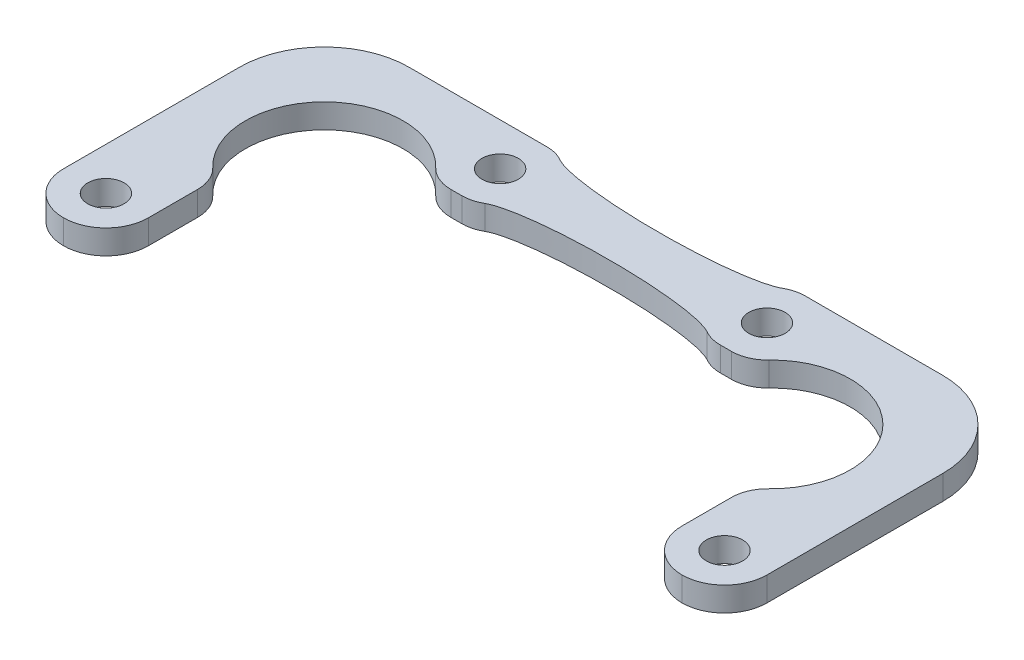
ISO-10303-21;
HEADER;
FILE_DESCRIPTION(('STEP AP214'),'2;1');
FILE_NAME('part.step','',(''),(''),'','','');
FILE_SCHEMA(('AUTOMOTIVE_DESIGN { 1 0 10303 214 1 1 1 1 }'));
ENDSEC;
DATA;
#1=APPLICATION_CONTEXT('core data for automotive mechanical design processes');
#2=APPLICATION_PROTOCOL_DEFINITION('international standard','automotive_design',2000,#1);
#3=PRODUCT_CONTEXT('',#1,'mechanical');
#4=PRODUCT('Part','Part','',(#3));
#5=PRODUCT_RELATED_PRODUCT_CATEGORY('part','',(#4));
#6=PRODUCT_DEFINITION_FORMATION('','',#4);
#7=PRODUCT_DEFINITION_CONTEXT('part definition',#1,'design');
#8=PRODUCT_DEFINITION('design','',#6,#7);
#9=PRODUCT_DEFINITION_SHAPE('','',#8);
#10=(LENGTH_UNIT() NAMED_UNIT(*) SI_UNIT(.MILLI.,.METRE.));
#11=(NAMED_UNIT(*) PLANE_ANGLE_UNIT() SI_UNIT($,.RADIAN.));
#12=(NAMED_UNIT(*) SI_UNIT($,.STERADIAN.) SOLID_ANGLE_UNIT());
#13=UNCERTAINTY_MEASURE_WITH_UNIT(LENGTH_MEASURE(1.E-05),#10,'distance_accuracy_value','');
#14=(GEOMETRIC_REPRESENTATION_CONTEXT(3) GLOBAL_UNCERTAINTY_ASSIGNED_CONTEXT((#13)) GLOBAL_UNIT_ASSIGNED_CONTEXT((#10,
#11,#12)) REPRESENTATION_CONTEXT('',''));
#15=CARTESIAN_POINT('',(0.,0.,0.));
#16=DIRECTION('',(0.,0.,1.));
#17=DIRECTION('',(1.,0.,0.));
#18=AXIS2_PLACEMENT_3D('',#15,#16,#17);
#19=CARTESIAN_POINT('',(-49.267229237635,2.,0.));
#20=DIRECTION('',(0.,0.,1.));
#21=DIRECTION('',(1.,0.,0.));
#22=AXIS2_PLACEMENT_3D('',#19,#20,#21);
#23=PLANE('',#22);
#24=DIRECTION('',(-1.,0.,0.));
#25=VECTOR('',#24,1.);
#26=CARTESIAN_POINT('',(-49.267229237635,2.,0.));
#27=LINE('',#26,#25);
#28=CARTESIAN_POINT('',(-10.6526722287908,2.,0.));
#29=VERTEX_POINT('',#28);
#30=CARTESIAN_POINT('',(-11.568376033097,2.,0.));
#31=VERTEX_POINT('',#30);
#32=EDGE_CURVE('E574',#29,#31,#27,.T.);
#33=ORIENTED_EDGE('',*,*,#32,.T.);
#34=DIRECTION('',(0.,1.,0.));
#35=VECTOR('',#34,1.);
#36=CARTESIAN_POINT('',(-11.568376033097,2.,0.));
#37=LINE('',#36,#35);
#38=CARTESIAN_POINT('',(-11.568376033097,0.,0.));
#39=VERTEX_POINT('',#38);
#40=EDGE_CURVE('E322',#31,#39,#37,.F.);
#41=ORIENTED_EDGE('',*,*,#40,.T.);
#42=DIRECTION('',(-1.,0.,0.));
#43=VECTOR('',#42,1.);
#44=CARTESIAN_POINT('',(-49.267229237635,0.,0.));
#45=LINE('',#44,#43);
#46=CARTESIAN_POINT('',(-10.6526722287908,0.,0.));
#47=VERTEX_POINT('',#46);
#48=EDGE_CURVE('E400',#47,#39,#45,.T.);
#49=ORIENTED_EDGE('',*,*,#48,.F.);
#50=DIRECTION('',(0.,1.,0.));
#51=VECTOR('',#50,1.);
#52=CARTESIAN_POINT('',(-10.6526722287908,2.,0.));
#53=LINE('',#52,#51);
#54=EDGE_CURVE('E319',#47,#29,#53,.T.);
#55=ORIENTED_EDGE('',*,*,#54,.T.);
#56=EDGE_LOOP('',(#33,#41,#49,#55));
#57=FACE_BOUND('',#56,.T.);
#58=ADVANCED_FACE('F34',(#57),#23,.T.);
#59=CARTESIAN_POINT('',(-49.267229237635,2.,5.50000000000001));
#60=DIRECTION('',(0.,1.,0.));
#61=DIRECTION('',(0.,0.,1.));
#62=AXIS2_PLACEMENT_3D('',#59,#60,#61);
#63=PLANE('',#62);
#64=CARTESIAN_POINT('',(-11.,2.,-3.5));
#65=DIRECTION('',(0.,1.,0.));
#66=DIRECTION('',(0.,0.,1.));
#67=AXIS2_PLACEMENT_3D('',#64,#65,#66);
#68=CIRCLE('',#67,1.5);
#69=CARTESIAN_POINT('',(-11.,2.,-2.));
#70=VERTEX_POINT('',#69);
#71=EDGE_CURVE('E250',#70,#70,#68,.T.);
#72=ORIENTED_EDGE('',*,*,#71,.F.);
#73=EDGE_LOOP('',(#72));
#74=FACE_BOUND('',#73,.T.);
#75=CARTESIAN_POINT('',(-25.5,2.,14.5));
#76=DIRECTION('',(0.,1.,0.));
#77=DIRECTION('',(0.,0.,1.));
#78=AXIS2_PLACEMENT_3D('',#75,#76,#77);
#79=CIRCLE('',#78,1.5);
#80=CARTESIAN_POINT('',(-25.5,2.,16.));
#81=VERTEX_POINT('',#80);
#82=EDGE_CURVE('E577',#81,#81,#79,.T.);
#83=ORIENTED_EDGE('',*,*,#82,.F.);
#84=EDGE_LOOP('',(#83));
#85=FACE_BOUND('',#84,.T.);
#86=CARTESIAN_POINT('',(11.,2.,-3.5));
#87=DIRECTION('',(0.,1.,0.));
#88=DIRECTION('',(0.,0.,1.));
#89=AXIS2_PLACEMENT_3D('',#86,#87,#88);
#90=CIRCLE('',#89,1.5);
#91=CARTESIAN_POINT('',(11.,2.,-2.));
#92=VERTEX_POINT('',#91);
#93=EDGE_CURVE('E391',#92,#92,#90,.F.);
#94=ORIENTED_EDGE('',*,*,#93,.T.);
#95=EDGE_LOOP('',(#94));
#96=FACE_BOUND('',#95,.T.);
#97=CARTESIAN_POINT('',(25.5,2.,14.5));
#98=DIRECTION('',(0.,1.,0.));
#99=DIRECTION('',(0.,0.,1.));
#100=AXIS2_PLACEMENT_3D('',#97,#98,#99);
#101=CIRCLE('',#100,1.5);
#102=CARTESIAN_POINT('',(25.5,2.,16.));
#103=VERTEX_POINT('',#102);
#104=EDGE_CURVE('E226',#103,#103,#101,.F.);
#105=ORIENTED_EDGE('',*,*,#104,.T.);
#106=EDGE_LOOP('',(#105));
#107=FACE_BOUND('',#106,.T.);
#108=DIRECTION('',(1.,0.,0.));
#109=VECTOR('',#108,1.);
#110=CARTESIAN_POINT('',(-49.267229237635,2.,-7.));
#111=LINE('',#110,#109);
#112=CARTESIAN_POINT('',(-22.,2.,-7.));
#113=VERTEX_POINT('',#112);
#114=CARTESIAN_POINT('',(-10.6526722287908,2.,-7.));
#115=VERTEX_POINT('',#114);
#116=EDGE_CURVE('E380',#113,#115,#111,.T.);
#117=ORIENTED_EDGE('',*,*,#116,.F.);
#118=CARTESIAN_POINT('',(-22.,2.,0.));
#119=DIRECTION('',(0.,1.,0.));
#120=DIRECTION('',(0.,0.,1.));
#121=AXIS2_PLACEMENT_3D('',#118,#119,#120);
#122=CIRCLE('',#121,7.);
#123=CARTESIAN_POINT('',(-29.,2.,0.));
#124=VERTEX_POINT('',#123);
#125=EDGE_CURVE('E361',#113,#124,#122,.T.);
#126=ORIENTED_EDGE('',*,*,#125,.T.);
#127=DIRECTION('',(0.,0.,-1.));
#128=VECTOR('',#127,1.);
#129=CARTESIAN_POINT('',(-29.,2.,5.50000000000001));
#130=LINE('',#129,#128);
#131=CARTESIAN_POINT('',(-29.,2.,14.5));
#132=VERTEX_POINT('',#131);
#133=EDGE_CURVE('E382',#132,#124,#130,.T.);
#134=ORIENTED_EDGE('',*,*,#133,.F.);
#135=CARTESIAN_POINT('',(-25.5,2.,14.5));
#136=DIRECTION('',(0.,1.,0.));
#137=DIRECTION('',(0.,0.,1.));
#138=AXIS2_PLACEMENT_3D('',#135,#136,#137);
#139=CIRCLE('',#138,3.5);
#140=CARTESIAN_POINT('',(-25.5,2.,18.));
#141=VERTEX_POINT('',#140);
#142=EDGE_CURVE('E219',#132,#141,#139,.T.);
#143=ORIENTED_EDGE('',*,*,#142,.T.);
#144=CARTESIAN_POINT('',(-25.5,2.,14.5));
#145=DIRECTION('',(0.,1.,0.));
#146=DIRECTION('',(0.,0.,1.));
#147=AXIS2_PLACEMENT_3D('',#144,#145,#146);
#148=CIRCLE('',#147,3.5);
#149=CARTESIAN_POINT('',(-22.,2.,14.5));
#150=VERTEX_POINT('',#149);
#151=EDGE_CURVE('E257',#141,#150,#148,.T.);
#152=ORIENTED_EDGE('',*,*,#151,.T.);
#153=DIRECTION('',(0.,0.,1.));
#154=VECTOR('',#153,1.);
#155=CARTESIAN_POINT('',(-22.,2.,5.5));
#156=LINE('',#155,#154);
#157=CARTESIAN_POINT('',(-22.,2.,10.431623966903));
#158=VERTEX_POINT('',#157);
#159=EDGE_CURVE('E389',#158,#150,#156,.T.);
#160=ORIENTED_EDGE('',*,*,#159,.F.);
#161=CARTESIAN_POINT('',(-25.,2.,10.431623966903));
#162=DIRECTION('',(0.,1.,0.));
#163=DIRECTION('',(0.,0.,1.));
#164=AXIS2_PLACEMENT_3D('',#161,#162,#163);
#165=CIRCLE('',#164,3.);
#166=CARTESIAN_POINT('',(-22.9269729515874,2.,8.26308555208307));
#167=VERTEX_POINT('',#166);
#168=EDGE_CURVE('E296',#158,#167,#165,.T.);
#169=ORIENTED_EDGE('',*,*,#168,.T.);
#170=CARTESIAN_POINT('',(-18.4354143466935,2.,3.56458565330652));
#171=DIRECTION('',(0.,-1.,0.));
#172=DIRECTION('',(0.,0.,-1.));
#173=AXIS2_PLACEMENT_3D('',#170,#171,#172);
#174=CIRCLE('',#173,6.5);
#175=CARTESIAN_POINT('',(-13.7369144479169,2.,-0.926972951587412));
#176=VERTEX_POINT('',#175);
#177=EDGE_CURVE('E558',#167,#176,#174,.T.);
#178=ORIENTED_EDGE('',*,*,#177,.T.);
#179=CARTESIAN_POINT('',(-11.568376033097,2.,-3.));
#180=DIRECTION('',(0.,1.,0.));
#181=DIRECTION('',(0.,0.,1.));
#182=AXIS2_PLACEMENT_3D('',#179,#180,#181);
#183=CIRCLE('',#182,3.);
#184=EDGE_CURVE('E294',#176,#31,#183,.T.);
#185=ORIENTED_EDGE('',*,*,#184,.T.);
#186=ORIENTED_EDGE('',*,*,#32,.F.);
#187=CARTESIAN_POINT('',(-10.6526722287908,2.,-2.99999999999999));
#188=DIRECTION('',(0.,1.,0.));
#189=DIRECTION('',(0.,0.,1.));
#190=AXIS2_PLACEMENT_3D('',#187,#188,#189);
#191=CIRCLE('',#190,3.);
#192=CARTESIAN_POINT('',(-9.15956668657666,2.,-0.397955450072106));
#193=VERTEX_POINT('',#192);
#194=EDGE_CURVE('E287',#29,#193,#191,.T.);
#195=ORIENTED_EDGE('',*,*,#194,.T.);
#196=CARTESIAN_POINT('',(0.,2.,0.));
#197=DIRECTION('',(0.,-1.,0.));
#198=DIRECTION('',(-1.,0.,0.));
#199=AXIS2_PLACEMENT_3D('',#196,#197,#198);
#200=ELLIPSE('',#199,9.5,1.5);
#201=CARTESIAN_POINT('',(9.15956668657666,2.,-0.397955450072107));
#202=VERTEX_POINT('',#201);
#203=EDGE_CURVE('E421',#193,#202,#200,.T.);
#204=ORIENTED_EDGE('',*,*,#203,.T.);
#205=CARTESIAN_POINT('',(10.6526722287908,2.,-2.99999999999999));
#206=DIRECTION('',(0.,1.,0.));
#207=DIRECTION('',(0.,0.,1.));
#208=AXIS2_PLACEMENT_3D('',#205,#206,#207);
#209=CIRCLE('',#208,3.);
#210=CARTESIAN_POINT('',(10.6526722287908,2.,0.));
#211=VERTEX_POINT('',#210);
#212=EDGE_CURVE('E281',#202,#211,#209,.T.);
#213=ORIENTED_EDGE('',*,*,#212,.T.);
#214=CARTESIAN_POINT('',(11.568376033097,2.,0.));
#215=VERTEX_POINT('',#214);
#216=EDGE_CURVE('E573',#215,#211,#27,.T.);
#217=ORIENTED_EDGE('',*,*,#216,.F.);
#218=CARTESIAN_POINT('',(11.568376033097,2.,-3.));
#219=DIRECTION('',(0.,1.,0.));
#220=DIRECTION('',(0.,0.,1.));
#221=AXIS2_PLACEMENT_3D('',#218,#219,#220);
#222=CIRCLE('',#221,3.);
#223=CARTESIAN_POINT('',(13.7369144479169,2.,-0.926972951587412));
#224=VERTEX_POINT('',#223);
#225=EDGE_CURVE('E283',#215,#224,#222,.T.);
#226=ORIENTED_EDGE('',*,*,#225,.T.);
#227=CARTESIAN_POINT('',(18.4354143466935,2.,3.56458565330652));
#228=DIRECTION('',(0.,1.,0.));
#229=DIRECTION('',(0.,0.,-1.));
#230=AXIS2_PLACEMENT_3D('',#227,#228,#229);
#231=CIRCLE('',#230,6.5);
#232=CARTESIAN_POINT('',(22.9269729515874,2.,8.26308555208307));
#233=VERTEX_POINT('',#232);
#234=EDGE_CURVE('E432',#233,#224,#231,.T.);
#235=ORIENTED_EDGE('',*,*,#234,.F.);
#236=CARTESIAN_POINT('',(25.,2.,10.431623966903));
#237=DIRECTION('',(0.,1.,0.));
#238=DIRECTION('',(0.,0.,1.));
#239=AXIS2_PLACEMENT_3D('',#236,#237,#238);
#240=CIRCLE('',#239,3.);
#241=CARTESIAN_POINT('',(22.,2.,10.431623966903));
#242=VERTEX_POINT('',#241);
#243=EDGE_CURVE('E285',#233,#242,#240,.T.);
#244=ORIENTED_EDGE('',*,*,#243,.T.);
#245=DIRECTION('',(0.,0.,1.));
#246=VECTOR('',#245,1.);
#247=CARTESIAN_POINT('',(22.,2.,5.50000000000002));
#248=LINE('',#247,#246);
#249=CARTESIAN_POINT('',(22.,2.,14.5));
#250=VERTEX_POINT('',#249);
#251=EDGE_CURVE('E383',#242,#250,#248,.T.);
#252=ORIENTED_EDGE('',*,*,#251,.T.);
#253=CARTESIAN_POINT('',(25.5,2.,14.5));
#254=DIRECTION('',(0.,1.,0.));
#255=DIRECTION('',(0.,0.,1.));
#256=AXIS2_PLACEMENT_3D('',#253,#254,#255);
#257=CIRCLE('',#256,3.5);
#258=CARTESIAN_POINT('',(25.5,2.,18.));
#259=VERTEX_POINT('',#258);
#260=EDGE_CURVE('E260',#250,#259,#257,.T.);
#261=ORIENTED_EDGE('',*,*,#260,.T.);
#262=CARTESIAN_POINT('',(25.5,2.,14.5));
#263=DIRECTION('',(0.,1.,0.));
#264=DIRECTION('',(0.,0.,1.));
#265=AXIS2_PLACEMENT_3D('',#262,#263,#264);
#266=CIRCLE('',#265,3.5);
#267=CARTESIAN_POINT('',(29.,2.,14.5));
#268=VERTEX_POINT('',#267);
#269=EDGE_CURVE('E262',#259,#268,#266,.T.);
#270=ORIENTED_EDGE('',*,*,#269,.T.);
#271=DIRECTION('',(0.,0.,-1.));
#272=VECTOR('',#271,1.);
#273=CARTESIAN_POINT('',(29.,2.,5.50000000000001));
#274=LINE('',#273,#272);
#275=CARTESIAN_POINT('',(29.,2.,0.));
#276=VERTEX_POINT('',#275);
#277=EDGE_CURVE('E224',#268,#276,#274,.T.);
#278=ORIENTED_EDGE('',*,*,#277,.T.);
#279=CARTESIAN_POINT('',(22.,2.,0.));
#280=DIRECTION('',(0.,1.,0.));
#281=DIRECTION('',(0.,0.,1.));
#282=AXIS2_PLACEMENT_3D('',#279,#280,#281);
#283=CIRCLE('',#282,7.);
#284=CARTESIAN_POINT('',(22.,2.,-7.));
#285=VERTEX_POINT('',#284);
#286=EDGE_CURVE('E49',#276,#285,#283,.T.);
#287=ORIENTED_EDGE('',*,*,#286,.T.);
#288=CARTESIAN_POINT('',(10.6526722287908,2.,-7.));
#289=VERTEX_POINT('',#288);
#290=EDGE_CURVE('E368',#289,#285,#111,.T.);
#291=ORIENTED_EDGE('',*,*,#290,.F.);
#292=CARTESIAN_POINT('',(10.6526722287908,2.,-4.00000000000001));
#293=DIRECTION('',(0.,1.,0.));
#294=DIRECTION('',(0.,0.,1.));
#295=AXIS2_PLACEMENT_3D('',#292,#293,#294);
#296=CIRCLE('',#295,3.);
#297=CARTESIAN_POINT('',(9.15956668657666,2.,-6.60204454992789));
#298=VERTEX_POINT('',#297);
#299=EDGE_CURVE('E289',#289,#298,#296,.T.);
#300=ORIENTED_EDGE('',*,*,#299,.T.);
#301=CARTESIAN_POINT('',(0.,2.,-7.));
#302=DIRECTION('',(0.,1.,0.));
#303=DIRECTION('',(-1.,0.,0.));
#304=AXIS2_PLACEMENT_3D('',#301,#302,#303);
#305=ELLIPSE('',#304,9.5,1.5);
#306=CARTESIAN_POINT('',(-9.15956668657666,2.,-6.60204454992789));
#307=VERTEX_POINT('',#306);
#308=EDGE_CURVE('E429',#307,#298,#305,.T.);
#309=ORIENTED_EDGE('',*,*,#308,.F.);
#310=CARTESIAN_POINT('',(-10.6526722287908,2.,-4.00000000000001));
#311=DIRECTION('',(0.,1.,0.));
#312=DIRECTION('',(0.,0.,1.));
#313=AXIS2_PLACEMENT_3D('',#310,#311,#312);
#314=CIRCLE('',#313,3.);
#315=EDGE_CURVE('E291',#307,#115,#314,.T.);
#316=ORIENTED_EDGE('',*,*,#315,.T.);
#317=EDGE_LOOP('',(#117,#126,#134,#143,#152,#160,#169,#178,#185,#186,#195,#204,#213,#217,#226,
#235,#244,#252,#261,#270,#278,#287,#291,#300,#309,#316));
#318=FACE_BOUND('',#317,.T.);
#319=ADVANCED_FACE('F377',(#74,#85,#96,#107,#318),#63,.T.);
#320=CARTESIAN_POINT('',(-49.267229237635,0.,5.50000000000001));
#321=DIRECTION('',(0.,1.,0.));
#322=DIRECTION('',(0.,0.,1.));
#323=AXIS2_PLACEMENT_3D('',#320,#321,#322);
#324=PLANE('',#323);
#325=CARTESIAN_POINT('',(-11.,0.,-3.5));
#326=DIRECTION('',(0.,1.,0.));
#327=DIRECTION('',(0.,0.,1.));
#328=AXIS2_PLACEMENT_3D('',#325,#326,#327);
#329=CIRCLE('',#328,1.5);
#330=CARTESIAN_POINT('',(-11.,0.,-2.));
#331=VERTEX_POINT('',#330);
#332=EDGE_CURVE('E274',#331,#331,#329,.T.);
#333=ORIENTED_EDGE('',*,*,#332,.T.);
#334=EDGE_LOOP('',(#333));
#335=FACE_BOUND('',#334,.T.);
#336=CARTESIAN_POINT('',(-25.5,0.,14.5));
#337=DIRECTION('',(0.,1.,0.));
#338=DIRECTION('',(0.,0.,1.));
#339=AXIS2_PLACEMENT_3D('',#336,#337,#338);
#340=CIRCLE('',#339,1.5);
#341=CARTESIAN_POINT('',(-25.5,0.,16.));
#342=VERTEX_POINT('',#341);
#343=EDGE_CURVE('E398',#342,#342,#340,.T.);
#344=ORIENTED_EDGE('',*,*,#343,.T.);
#345=EDGE_LOOP('',(#344));
#346=FACE_BOUND('',#345,.T.);
#347=CARTESIAN_POINT('',(11.,0.,-3.5));
#348=DIRECTION('',(0.,1.,0.));
#349=DIRECTION('',(0.,0.,1.));
#350=AXIS2_PLACEMENT_3D('',#347,#348,#349);
#351=CIRCLE('',#350,1.5);
#352=CARTESIAN_POINT('',(11.,0.,-2.));
#353=VERTEX_POINT('',#352);
#354=EDGE_CURVE('E245',#353,#353,#351,.F.);
#355=ORIENTED_EDGE('',*,*,#354,.F.);
#356=EDGE_LOOP('',(#355));
#357=FACE_BOUND('',#356,.T.);
#358=CARTESIAN_POINT('',(25.5,0.,14.5));
#359=DIRECTION('',(0.,1.,0.));
#360=DIRECTION('',(0.,0.,1.));
#361=AXIS2_PLACEMENT_3D('',#358,#359,#360);
#362=CIRCLE('',#361,1.5);
#363=CARTESIAN_POINT('',(25.5,0.,16.));
#364=VERTEX_POINT('',#363);
#365=EDGE_CURVE('E248',#364,#364,#362,.F.);
#366=ORIENTED_EDGE('',*,*,#365,.F.);
#367=EDGE_LOOP('',(#366));
#368=FACE_BOUND('',#367,.T.);
#369=DIRECTION('',(0.,0.,-1.));
#370=VECTOR('',#369,1.);
#371=CARTESIAN_POINT('',(-29.,0.,5.50000000000001));
#372=LINE('',#371,#370);
#373=CARTESIAN_POINT('',(-29.,0.,14.5));
#374=VERTEX_POINT('',#373);
#375=CARTESIAN_POINT('',(-29.,0.,0.));
#376=VERTEX_POINT('',#375);
#377=EDGE_CURVE('E241',#374,#376,#372,.T.);
#378=ORIENTED_EDGE('',*,*,#377,.T.);
#379=CARTESIAN_POINT('',(-22.,0.,0.));
#380=DIRECTION('',(0.,1.,0.));
#381=DIRECTION('',(0.,0.,1.));
#382=AXIS2_PLACEMENT_3D('',#379,#380,#381);
#383=CIRCLE('',#382,7.);
#384=CARTESIAN_POINT('',(-22.,0.,-7.));
#385=VERTEX_POINT('',#384);
#386=EDGE_CURVE('E356',#376,#385,#383,.F.);
#387=ORIENTED_EDGE('',*,*,#386,.T.);
#388=DIRECTION('',(1.,0.,0.));
#389=VECTOR('',#388,1.);
#390=CARTESIAN_POINT('',(-49.267229237635,0.,-7.));
#391=LINE('',#390,#389);
#392=CARTESIAN_POINT('',(-10.6526722287908,0.,-7.));
#393=VERTEX_POINT('',#392);
#394=EDGE_CURVE('E235',#385,#393,#391,.T.);
#395=ORIENTED_EDGE('',*,*,#394,.T.);
#396=CARTESIAN_POINT('',(-10.6526722287908,0.,-4.00000000000001));
#397=DIRECTION('',(0.,1.,0.));
#398=DIRECTION('',(0.,0.,1.));
#399=AXIS2_PLACEMENT_3D('',#396,#397,#398);
#400=CIRCLE('',#399,3.);
#401=CARTESIAN_POINT('',(-9.15956668657666,0.,-6.60204454992789));
#402=VERTEX_POINT('',#401);
#403=EDGE_CURVE('E313',#393,#402,#400,.F.);
#404=ORIENTED_EDGE('',*,*,#403,.T.);
#405=CARTESIAN_POINT('',(0.,0.,-7.));
#406=DIRECTION('',(0.,1.,0.));
#407=DIRECTION('',(-1.,0.,0.));
#408=AXIS2_PLACEMENT_3D('',#405,#406,#407);
#409=ELLIPSE('',#408,9.5,1.5);
#410=CARTESIAN_POINT('',(9.15956668657666,0.,-6.60204454992789));
#411=VERTEX_POINT('',#410);
#412=EDGE_CURVE('E278',#411,#402,#409,.F.);
#413=ORIENTED_EDGE('',*,*,#412,.F.);
#414=CARTESIAN_POINT('',(10.6526722287908,0.,-4.00000000000001));
#415=DIRECTION('',(0.,1.,0.));
#416=DIRECTION('',(0.,0.,1.));
#417=AXIS2_PLACEMENT_3D('',#414,#415,#416);
#418=CIRCLE('',#417,3.);
#419=CARTESIAN_POINT('',(10.6526722287908,0.,-7.));
#420=VERTEX_POINT('',#419);
#421=EDGE_CURVE('E311',#411,#420,#418,.F.);
#422=ORIENTED_EDGE('',*,*,#421,.T.);
#423=CARTESIAN_POINT('',(22.,0.,-7.));
#424=VERTEX_POINT('',#423);
#425=EDGE_CURVE('E232',#420,#424,#391,.T.);
#426=ORIENTED_EDGE('',*,*,#425,.T.);
#427=CARTESIAN_POINT('',(22.,0.,0.));
#428=DIRECTION('',(0.,1.,0.));
#429=DIRECTION('',(0.,0.,1.));
#430=AXIS2_PLACEMENT_3D('',#427,#428,#429);
#431=CIRCLE('',#430,7.);
#432=CARTESIAN_POINT('',(29.,0.,0.));
#433=VERTEX_POINT('',#432);
#434=EDGE_CURVE('E231',#424,#433,#431,.F.);
#435=ORIENTED_EDGE('',*,*,#434,.T.);
#436=DIRECTION('',(0.,0.,-1.));
#437=VECTOR('',#436,1.);
#438=CARTESIAN_POINT('',(29.,0.,5.50000000000001));
#439=LINE('',#438,#437);
#440=CARTESIAN_POINT('',(29.,0.,14.5));
#441=VERTEX_POINT('',#440);
#442=EDGE_CURVE('E223',#441,#433,#439,.T.);
#443=ORIENTED_EDGE('',*,*,#442,.F.);
#444=CARTESIAN_POINT('',(25.5,0.,14.5));
#445=DIRECTION('',(0.,1.,0.));
#446=DIRECTION('',(0.,0.,1.));
#447=AXIS2_PLACEMENT_3D('',#444,#445,#446);
#448=CIRCLE('',#447,3.5);
#449=CARTESIAN_POINT('',(25.5,0.,18.));
#450=VERTEX_POINT('',#449);
#451=EDGE_CURVE('E208',#441,#450,#448,.F.);
#452=ORIENTED_EDGE('',*,*,#451,.T.);
#453=CARTESIAN_POINT('',(25.5,0.,14.5));
#454=DIRECTION('',(0.,1.,0.));
#455=DIRECTION('',(0.,0.,1.));
#456=AXIS2_PLACEMENT_3D('',#453,#454,#455);
#457=CIRCLE('',#456,3.5);
#458=CARTESIAN_POINT('',(22.,0.,14.5));
#459=VERTEX_POINT('',#458);
#460=EDGE_CURVE('E220',#450,#459,#457,.F.);
#461=ORIENTED_EDGE('',*,*,#460,.T.);
#462=DIRECTION('',(0.,0.,1.));
#463=VECTOR('',#462,1.);
#464=CARTESIAN_POINT('',(22.,0.,5.50000000000002));
#465=LINE('',#464,#463);
#466=CARTESIAN_POINT('',(22.,0.,10.431623966903));
#467=VERTEX_POINT('',#466);
#468=EDGE_CURVE('E233',#467,#459,#465,.T.);
#469=ORIENTED_EDGE('',*,*,#468,.F.);
#470=CARTESIAN_POINT('',(25.,0.,10.431623966903));
#471=DIRECTION('',(0.,1.,0.));
#472=DIRECTION('',(0.,0.,1.));
#473=AXIS2_PLACEMENT_3D('',#470,#471,#472);
#474=CIRCLE('',#473,3.);
#475=CARTESIAN_POINT('',(22.9269729515874,0.,8.26308555208307));
#476=VERTEX_POINT('',#475);
#477=EDGE_CURVE('E307',#467,#476,#474,.F.);
#478=ORIENTED_EDGE('',*,*,#477,.T.);
#479=CARTESIAN_POINT('',(18.4354143466935,0.,3.56458565330652));
#480=DIRECTION('',(0.,1.,0.));
#481=DIRECTION('',(0.,0.,1.));
#482=AXIS2_PLACEMENT_3D('',#479,#480,#481);
#483=CIRCLE('',#482,6.5);
#484=CARTESIAN_POINT('',(13.7369144479169,0.,-0.926972951587412));
#485=VERTEX_POINT('',#484);
#486=EDGE_CURVE('E427',#485,#476,#483,.F.);
#487=ORIENTED_EDGE('',*,*,#486,.F.);
#488=CARTESIAN_POINT('',(11.568376033097,0.,-3.));
#489=DIRECTION('',(0.,1.,0.));
#490=DIRECTION('',(0.,0.,1.));
#491=AXIS2_PLACEMENT_3D('',#488,#489,#490);
#492=CIRCLE('',#491,3.);
#493=CARTESIAN_POINT('',(11.568376033097,0.,0.));
#494=VERTEX_POINT('',#493);
#495=EDGE_CURVE('E305',#485,#494,#492,.F.);
#496=ORIENTED_EDGE('',*,*,#495,.T.);
#497=CARTESIAN_POINT('',(10.6526722287908,0.,0.));
#498=VERTEX_POINT('',#497);
#499=EDGE_CURVE('E237',#494,#498,#45,.T.);
#500=ORIENTED_EDGE('',*,*,#499,.T.);
#501=CARTESIAN_POINT('',(10.6526722287908,0.,-2.99999999999999));
#502=DIRECTION('',(0.,1.,0.));
#503=DIRECTION('',(0.,0.,1.));
#504=AXIS2_PLACEMENT_3D('',#501,#502,#503);
#505=CIRCLE('',#504,3.);
#506=CARTESIAN_POINT('',(9.15956668657666,0.,-0.397955450072107));
#507=VERTEX_POINT('',#506);
#508=EDGE_CURVE('E303',#498,#507,#505,.F.);
#509=ORIENTED_EDGE('',*,*,#508,.T.);
#510=CARTESIAN_POINT('',(0.,0.,0.));
#511=DIRECTION('',(0.,-1.,0.));
#512=DIRECTION('',(-1.,0.,0.));
#513=AXIS2_PLACEMENT_3D('',#510,#511,#512);
#514=ELLIPSE('',#513,9.5,1.5);
#515=CARTESIAN_POINT('',(-9.15956668657666,0.,-0.397955450072106));
#516=VERTEX_POINT('',#515);
#517=EDGE_CURVE('E423',#507,#516,#514,.F.);
#518=ORIENTED_EDGE('',*,*,#517,.T.);
#519=CARTESIAN_POINT('',(-10.6526722287908,0.,-2.99999999999999));
#520=DIRECTION('',(0.,1.,0.));
#521=DIRECTION('',(0.,0.,1.));
#522=AXIS2_PLACEMENT_3D('',#519,#520,#521);
#523=CIRCLE('',#522,3.);
#524=EDGE_CURVE('E309',#516,#47,#523,.F.);
#525=ORIENTED_EDGE('',*,*,#524,.T.);
#526=ORIENTED_EDGE('',*,*,#48,.T.);
#527=CARTESIAN_POINT('',(-11.568376033097,0.,-3.));
#528=DIRECTION('',(0.,1.,0.));
#529=DIRECTION('',(0.,0.,1.));
#530=AXIS2_PLACEMENT_3D('',#527,#528,#529);
#531=CIRCLE('',#530,3.);
#532=CARTESIAN_POINT('',(-13.7369144479169,0.,-0.926972951587412));
#533=VERTEX_POINT('',#532);
#534=EDGE_CURVE('E315',#39,#533,#531,.F.);
#535=ORIENTED_EDGE('',*,*,#534,.T.);
#536=CARTESIAN_POINT('',(-18.4354143466935,0.,3.56458565330652));
#537=DIRECTION('',(0.,1.,0.));
#538=DIRECTION('',(0.,0.,1.));
#539=AXIS2_PLACEMENT_3D('',#536,#537,#538);
#540=CIRCLE('',#539,6.5);
#541=CARTESIAN_POINT('',(-22.9269729515874,0.,8.26308555208307));
#542=VERTEX_POINT('',#541);
#543=EDGE_CURVE('E563',#533,#542,#540,.T.);
#544=ORIENTED_EDGE('',*,*,#543,.T.);
#545=CARTESIAN_POINT('',(-25.,0.,10.431623966903));
#546=DIRECTION('',(0.,1.,0.));
#547=DIRECTION('',(0.,0.,1.));
#548=AXIS2_PLACEMENT_3D('',#545,#546,#547);
#549=CIRCLE('',#548,3.);
#550=CARTESIAN_POINT('',(-22.,0.,10.431623966903));
#551=VERTEX_POINT('',#550);
#552=EDGE_CURVE('E317',#542,#551,#549,.F.);
#553=ORIENTED_EDGE('',*,*,#552,.T.);
#554=DIRECTION('',(0.,0.,1.));
#555=VECTOR('',#554,1.);
#556=CARTESIAN_POINT('',(-22.,0.,5.5));
#557=LINE('',#556,#555);
#558=CARTESIAN_POINT('',(-22.,0.,14.5));
#559=VERTEX_POINT('',#558);
#560=EDGE_CURVE('E243',#551,#559,#557,.T.);
#561=ORIENTED_EDGE('',*,*,#560,.T.);
#562=CARTESIAN_POINT('',(-25.5,0.,14.5));
#563=DIRECTION('',(0.,1.,0.));
#564=DIRECTION('',(0.,0.,1.));
#565=AXIS2_PLACEMENT_3D('',#562,#563,#564);
#566=CIRCLE('',#565,3.5);
#567=CARTESIAN_POINT('',(-25.5,0.,18.));
#568=VERTEX_POINT('',#567);
#569=EDGE_CURVE('E253',#559,#568,#566,.F.);
#570=ORIENTED_EDGE('',*,*,#569,.T.);
#571=CARTESIAN_POINT('',(-25.5,0.,14.5));
#572=DIRECTION('',(0.,1.,0.));
#573=DIRECTION('',(0.,0.,1.));
#574=AXIS2_PLACEMENT_3D('',#571,#572,#573);
#575=CIRCLE('',#574,3.5);
#576=EDGE_CURVE('E225',#568,#374,#575,.F.);
#577=ORIENTED_EDGE('',*,*,#576,.T.);
#578=EDGE_LOOP('',(#378,#387,#395,#404,#413,#422,#426,#435,#443,#452,#461,#469,#478,#487,#496,
#500,#509,#518,#525,#526,#535,#544,#553,#561,#570,#577));
#579=FACE_BOUND('',#578,.T.);
#580=ADVANCED_FACE('F229',(#335,#346,#357,#368,#579),#324,.F.);
#581=CARTESIAN_POINT('',(-22.,2.,5.5));
#582=DIRECTION('',(1.,0.,0.));
#583=DIRECTION('',(0.,0.,-1.));
#584=AXIS2_PLACEMENT_3D('',#581,#582,#583);
#585=PLANE('',#584);
#586=ORIENTED_EDGE('',*,*,#560,.F.);
#587=DIRECTION('',(0.,1.,0.));
#588=VECTOR('',#587,1.);
#589=CARTESIAN_POINT('',(-22.,2.,10.431623966903));
#590=LINE('',#589,#588);
#591=EDGE_CURVE('E272',#551,#158,#590,.T.);
#592=ORIENTED_EDGE('',*,*,#591,.T.);
#593=ORIENTED_EDGE('',*,*,#159,.T.);
#594=DIRECTION('',(0.,-1.,0.));
#595=VECTOR('',#594,1.);
#596=CARTESIAN_POINT('',(-22.,2.,14.5));
#597=LINE('',#596,#595);
#598=EDGE_CURVE('E267',#150,#559,#597,.T.);
#599=ORIENTED_EDGE('',*,*,#598,.T.);
#600=EDGE_LOOP('',(#586,#592,#593,#599));
#601=FACE_BOUND('',#600,.T.);
#602=ADVANCED_FACE('F454',(#601),#585,.T.);
#603=ORIENTED_EDGE('',*,*,#499,.F.);
#604=DIRECTION('',(0.,-1.,0.));
#605=VECTOR('',#604,1.);
#606=CARTESIAN_POINT('',(11.568376033097,2.,0.));
#607=LINE('',#606,#605);
#608=EDGE_CURVE('E349',#494,#215,#607,.F.);
#609=ORIENTED_EDGE('',*,*,#608,.T.);
#610=ORIENTED_EDGE('',*,*,#216,.T.);
#611=DIRECTION('',(0.,1.,0.));
#612=VECTOR('',#611,1.);
#613=CARTESIAN_POINT('',(10.6526722287908,2.,0.));
#614=LINE('',#613,#612);
#615=EDGE_CURVE('E347',#211,#498,#614,.F.);
#616=ORIENTED_EDGE('',*,*,#615,.T.);
#617=EDGE_LOOP('',(#603,#609,#610,#616));
#618=FACE_BOUND('',#617,.T.);
#619=ADVANCED_FACE('F470',(#618),#23,.T.);
#620=CARTESIAN_POINT('',(-49.267229237635,2.,-7.));
#621=DIRECTION('',(0.,0.,-1.));
#622=DIRECTION('',(-1.,0.,0.));
#623=AXIS2_PLACEMENT_3D('',#620,#621,#622);
#624=PLANE('',#623);
#625=ORIENTED_EDGE('',*,*,#394,.F.);
#626=DIRECTION('',(0.,-1.,0.));
#627=VECTOR('',#626,1.);
#628=CARTESIAN_POINT('',(-22.,2.,-7.));
#629=LINE('',#628,#627);
#630=EDGE_CURVE('E358',#385,#113,#629,.F.);
#631=ORIENTED_EDGE('',*,*,#630,.T.);
#632=ORIENTED_EDGE('',*,*,#116,.T.);
#633=DIRECTION('',(0.,-1.,0.));
#634=VECTOR('',#633,1.);
#635=CARTESIAN_POINT('',(-10.6526722287908,0.,-7.));
#636=LINE('',#635,#634);
#637=EDGE_CURVE('E329',#115,#393,#636,.T.);
#638=ORIENTED_EDGE('',*,*,#637,.T.);
#639=EDGE_LOOP('',(#625,#631,#632,#638));
#640=FACE_BOUND('',#639,.T.);
#641=ADVANCED_FACE('F477',(#640),#624,.T.);
#642=CARTESIAN_POINT('',(22.,2.,5.50000000000002));
#643=DIRECTION('',(1.,0.,0.));
#644=DIRECTION('',(0.,0.,-1.));
#645=AXIS2_PLACEMENT_3D('',#642,#643,#644);
#646=PLANE('',#645);
#647=ORIENTED_EDGE('',*,*,#251,.F.);
#648=DIRECTION('',(0.,1.,0.));
#649=VECTOR('',#648,1.);
#650=CARTESIAN_POINT('',(22.,2.,10.431623966903));
#651=LINE('',#650,#649);
#652=EDGE_CURVE('E345',#242,#467,#651,.F.);
#653=ORIENTED_EDGE('',*,*,#652,.T.);
#654=ORIENTED_EDGE('',*,*,#468,.T.);
#655=DIRECTION('',(0.,-1.,0.));
#656=VECTOR('',#655,1.);
#657=CARTESIAN_POINT('',(22.,2.,14.5));
#658=LINE('',#657,#656);
#659=EDGE_CURVE('E264',#459,#250,#658,.F.);
#660=ORIENTED_EDGE('',*,*,#659,.T.);
#661=EDGE_LOOP('',(#647,#653,#654,#660));
#662=FACE_BOUND('',#661,.T.);
#663=ADVANCED_FACE('F480',(#662),#646,.F.);
#664=CARTESIAN_POINT('',(29.,2.,5.50000000000001));
#665=DIRECTION('',(-1.,0.,0.));
#666=DIRECTION('',(0.,0.,1.));
#667=AXIS2_PLACEMENT_3D('',#664,#665,#666);
#668=PLANE('',#667);
#669=ORIENTED_EDGE('',*,*,#442,.T.);
#670=DIRECTION('',(0.,-1.,0.));
#671=VECTOR('',#670,1.);
#672=CARTESIAN_POINT('',(29.,2.,0.));
#673=LINE('',#672,#671);
#674=EDGE_CURVE('E11',#433,#276,#673,.F.);
#675=ORIENTED_EDGE('',*,*,#674,.T.);
#676=ORIENTED_EDGE('',*,*,#277,.F.);
#677=DIRECTION('',(0.,-1.,0.));
#678=VECTOR('',#677,1.);
#679=CARTESIAN_POINT('',(29.,2.,14.5));
#680=LINE('',#679,#678);
#681=EDGE_CURVE('E212',#268,#441,#680,.T.);
#682=ORIENTED_EDGE('',*,*,#681,.T.);
#683=EDGE_LOOP('',(#669,#675,#676,#682));
#684=FACE_BOUND('',#683,.T.);
#685=ADVANCED_FACE('F222',(#684),#668,.F.);
#686=ORIENTED_EDGE('',*,*,#290,.T.);
#687=DIRECTION('',(0.,-1.,0.));
#688=VECTOR('',#687,1.);
#689=CARTESIAN_POINT('',(22.,0.,-7.));
#690=LINE('',#689,#688);
#691=EDGE_CURVE('E42',#285,#424,#690,.T.);
#692=ORIENTED_EDGE('',*,*,#691,.T.);
#693=ORIENTED_EDGE('',*,*,#425,.F.);
#694=DIRECTION('',(0.,-1.,0.));
#695=VECTOR('',#694,1.);
#696=CARTESIAN_POINT('',(10.6526722287908,2.,-7.));
#697=LINE('',#696,#695);
#698=EDGE_CURVE('E332',#420,#289,#697,.F.);
#699=ORIENTED_EDGE('',*,*,#698,.T.);
#700=EDGE_LOOP('',(#686,#692,#693,#699));
#701=FACE_BOUND('',#700,.T.);
#702=ADVANCED_FACE('F366',(#701),#624,.T.);
#703=CARTESIAN_POINT('',(-29.,2.,5.50000000000001));
#704=DIRECTION('',(-1.,0.,0.));
#705=DIRECTION('',(0.,0.,1.));
#706=AXIS2_PLACEMENT_3D('',#703,#704,#705);
#707=PLANE('',#706);
#708=ORIENTED_EDGE('',*,*,#133,.T.);
#709=DIRECTION('',(0.,-1.,0.));
#710=VECTOR('',#709,1.);
#711=CARTESIAN_POINT('',(-29.,2.,0.));
#712=LINE('',#711,#710);
#713=EDGE_CURVE('E352',#124,#376,#712,.T.);
#714=ORIENTED_EDGE('',*,*,#713,.T.);
#715=ORIENTED_EDGE('',*,*,#377,.F.);
#716=DIRECTION('',(0.,-1.,0.));
#717=VECTOR('',#716,1.);
#718=CARTESIAN_POINT('',(-29.,2.,14.5));
#719=LINE('',#718,#717);
#720=EDGE_CURVE('E270',#374,#132,#719,.F.);
#721=ORIENTED_EDGE('',*,*,#720,.T.);
#722=EDGE_LOOP('',(#708,#714,#715,#721));
#723=FACE_BOUND('',#722,.T.);
#724=ADVANCED_FACE('F466',(#723),#707,.T.);
#725=CARTESIAN_POINT('',(11.,2.,-3.5));
#726=DIRECTION('',(0.,-1.,0.));
#727=DIRECTION('',(0.,0.,-1.));
#728=AXIS2_PLACEMENT_3D('',#725,#726,#727);
#729=CYLINDRICAL_SURFACE('',#728,1.5);
#730=ORIENTED_EDGE('',*,*,#93,.F.);
#731=EDGE_LOOP('',(#730));
#732=FACE_BOUND('',#731,.T.);
#733=ORIENTED_EDGE('',*,*,#354,.T.);
#734=EDGE_LOOP('',(#733));
#735=FACE_BOUND('',#734,.T.);
#736=ADVANCED_FACE('F462',(#732,#735),#729,.F.);
#737=CARTESIAN_POINT('',(-25.5,2.,14.5));
#738=DIRECTION('',(0.,-1.,0.));
#739=DIRECTION('',(0.,0.,-1.));
#740=AXIS2_PLACEMENT_3D('',#737,#738,#739);
#741=CYLINDRICAL_SURFACE('',#740,1.5);
#742=ORIENTED_EDGE('',*,*,#82,.T.);
#743=EDGE_LOOP('',(#742));
#744=FACE_BOUND('',#743,.T.);
#745=ORIENTED_EDGE('',*,*,#343,.F.);
#746=EDGE_LOOP('',(#745));
#747=FACE_BOUND('',#746,.T.);
#748=ADVANCED_FACE('F465',(#744,#747),#741,.F.);
#749=CARTESIAN_POINT('',(-11.,2.,-3.5));
#750=DIRECTION('',(0.,-1.,0.));
#751=DIRECTION('',(0.,0.,-1.));
#752=AXIS2_PLACEMENT_3D('',#749,#750,#751);
#753=CYLINDRICAL_SURFACE('',#752,1.5);
#754=ORIENTED_EDGE('',*,*,#71,.T.);
#755=EDGE_LOOP('',(#754));
#756=FACE_BOUND('',#755,.T.);
#757=ORIENTED_EDGE('',*,*,#332,.F.);
#758=EDGE_LOOP('',(#757));
#759=FACE_BOUND('',#758,.T.);
#760=ADVANCED_FACE('F460',(#756,#759),#753,.F.);
#761=CARTESIAN_POINT('',(25.5,2.,14.5));
#762=DIRECTION('',(0.,-1.,0.));
#763=DIRECTION('',(0.,0.,-1.));
#764=AXIS2_PLACEMENT_3D('',#761,#762,#763);
#765=CYLINDRICAL_SURFACE('',#764,1.5);
#766=ORIENTED_EDGE('',*,*,#104,.F.);
#767=EDGE_LOOP('',(#766));
#768=FACE_BOUND('',#767,.T.);
#769=ORIENTED_EDGE('',*,*,#365,.T.);
#770=EDGE_LOOP('',(#769));
#771=FACE_BOUND('',#770,.T.);
#772=ADVANCED_FACE('F456',(#768,#771),#765,.F.);
#773=CARTESIAN_POINT('',(25.5,2.,14.5));
#774=DIRECTION('',(0.,-1.,0.));
#775=DIRECTION('',(0.,0.,-1.));
#776=AXIS2_PLACEMENT_3D('',#773,#774,#775);
#777=CYLINDRICAL_SURFACE('',#776,3.5);
#778=DIRECTION('',(0.,-1.,0.));
#779=VECTOR('',#778,1.);
#780=CARTESIAN_POINT('',(25.5,2.,18.));
#781=LINE('',#780,#779);
#782=EDGE_CURVE('E214',#259,#450,#781,.T.);
#783=ORIENTED_EDGE('',*,*,#782,.F.);
#784=ORIENTED_EDGE('',*,*,#260,.F.);
#785=ORIENTED_EDGE('',*,*,#659,.F.);
#786=ORIENTED_EDGE('',*,*,#460,.F.);
#787=EDGE_LOOP('',(#783,#784,#785,#786));
#788=FACE_BOUND('',#787,.T.);
#789=ADVANCED_FACE('F459',(#788),#777,.T.);
#790=CARTESIAN_POINT('',(25.5,2.,14.5));
#791=DIRECTION('',(0.,-1.,0.));
#792=DIRECTION('',(0.,0.,-1.));
#793=AXIS2_PLACEMENT_3D('',#790,#791,#792);
#794=CYLINDRICAL_SURFACE('',#793,3.5);
#795=ORIENTED_EDGE('',*,*,#269,.F.);
#796=ORIENTED_EDGE('',*,*,#782,.T.);
#797=ORIENTED_EDGE('',*,*,#451,.F.);
#798=ORIENTED_EDGE('',*,*,#681,.F.);
#799=EDGE_LOOP('',(#795,#796,#797,#798));
#800=FACE_BOUND('',#799,.T.);
#801=ADVANCED_FACE('F211',(#800),#794,.T.);
#802=CARTESIAN_POINT('',(-25.5,2.,14.5));
#803=DIRECTION('',(0.,-1.,0.));
#804=DIRECTION('',(0.,0.,-1.));
#805=AXIS2_PLACEMENT_3D('',#802,#803,#804);
#806=CYLINDRICAL_SURFACE('',#805,3.5);
#807=DIRECTION('',(0.,-1.,0.));
#808=VECTOR('',#807,1.);
#809=CARTESIAN_POINT('',(-25.5,2.,18.));
#810=LINE('',#809,#808);
#811=EDGE_CURVE('E275',#141,#568,#810,.T.);
#812=ORIENTED_EDGE('',*,*,#811,.F.);
#813=ORIENTED_EDGE('',*,*,#142,.F.);
#814=ORIENTED_EDGE('',*,*,#720,.F.);
#815=ORIENTED_EDGE('',*,*,#576,.F.);
#816=EDGE_LOOP('',(#812,#813,#814,#815));
#817=FACE_BOUND('',#816,.T.);
#818=ADVANCED_FACE('F495',(#817),#806,.T.);
#819=CARTESIAN_POINT('',(-25.5,2.,14.5));
#820=DIRECTION('',(0.,-1.,0.));
#821=DIRECTION('',(0.,0.,-1.));
#822=AXIS2_PLACEMENT_3D('',#819,#820,#821);
#823=CYLINDRICAL_SURFACE('',#822,3.5);
#824=ORIENTED_EDGE('',*,*,#151,.F.);
#825=ORIENTED_EDGE('',*,*,#811,.T.);
#826=ORIENTED_EDGE('',*,*,#569,.F.);
#827=ORIENTED_EDGE('',*,*,#598,.F.);
#828=EDGE_LOOP('',(#824,#825,#826,#827));
#829=FACE_BOUND('',#828,.T.);
#830=ADVANCED_FACE('F446',(#829),#823,.T.);
#831=CARTESIAN_POINT('',(0.,-19.0591185525459,-7.));
#832=DIRECTION('',(0.,1.,0.));
#833=DIRECTION('',(-1.,0.,0.));
#834=AXIS2_PLACEMENT_3D('',#831,#832,#833);
#835=ELLIPSE('',#834,9.5,1.5);
#836=DIRECTION('',(0.,1.,0.));
#837=VECTOR('',#836,1.);
#838=SURFACE_OF_LINEAR_EXTRUSION('',#835,#837);
#839=ORIENTED_EDGE('',*,*,#412,.T.);
#840=DIRECTION('',(0.,1.,0.));
#841=VECTOR('',#840,1.);
#842=CARTESIAN_POINT('',(-9.15956668657666,0.,-6.60204454992789));
#843=LINE('',#842,#841);
#844=EDGE_CURVE('E326',#402,#307,#843,.T.);
#845=ORIENTED_EDGE('',*,*,#844,.T.);
#846=ORIENTED_EDGE('',*,*,#308,.T.);
#847=DIRECTION('',(0.,1.,0.));
#848=VECTOR('',#847,1.);
#849=CARTESIAN_POINT('',(9.15956668657666,2.,-6.60204454992789));
#850=LINE('',#849,#848);
#851=EDGE_CURVE('E324',#298,#411,#850,.F.);
#852=ORIENTED_EDGE('',*,*,#851,.T.);
#853=EDGE_LOOP('',(#839,#845,#846,#852));
#854=FACE_BOUND('',#853,.T.);
#855=ADVANCED_FACE('F442',(#854),#838,.F.);
#856=CARTESIAN_POINT('',(0.,-19.0591185525459,0.));
#857=DIRECTION('',(0.,-1.,0.));
#858=DIRECTION('',(-1.,0.,0.));
#859=AXIS2_PLACEMENT_3D('',#856,#857,#858);
#860=ELLIPSE('',#859,9.5,1.5);
#861=DIRECTION('',(0.,1.,0.));
#862=VECTOR('',#861,1.);
#863=SURFACE_OF_LINEAR_EXTRUSION('',#860,#862);
#864=ORIENTED_EDGE('',*,*,#203,.F.);
#865=DIRECTION('',(0.,1.,0.));
#866=VECTOR('',#865,1.);
#867=CARTESIAN_POINT('',(-9.15956668657666,2.,-0.397955450072106));
#868=LINE('',#867,#866);
#869=EDGE_CURVE('E338',#193,#516,#868,.F.);
#870=ORIENTED_EDGE('',*,*,#869,.T.);
#871=ORIENTED_EDGE('',*,*,#517,.F.);
#872=DIRECTION('',(0.,1.,0.));
#873=VECTOR('',#872,1.);
#874=CARTESIAN_POINT('',(9.15956668657666,0.,-0.397955450072106));
#875=LINE('',#874,#873);
#876=EDGE_CURVE('E335',#507,#202,#875,.T.);
#877=ORIENTED_EDGE('',*,*,#876,.T.);
#878=EDGE_LOOP('',(#864,#870,#871,#877));
#879=FACE_BOUND('',#878,.T.);
#880=ADVANCED_FACE('F420',(#879),#863,.T.);
#881=CARTESIAN_POINT('',(18.4354143466935,-16.8792248416363,3.56458565330652));
#882=DIRECTION('',(0.,1.,0.));
#883=DIRECTION('',(0.,0.,1.));
#884=AXIS2_PLACEMENT_3D('',#881,#882,#883);
#885=CYLINDRICAL_SURFACE('',#884,6.5);
#886=ORIENTED_EDGE('',*,*,#486,.T.);
#887=DIRECTION('',(0.,1.,0.));
#888=VECTOR('',#887,1.);
#889=CARTESIAN_POINT('',(22.9269729515874,-16.8792248416363,8.26308555208307));
#890=LINE('',#889,#888);
#891=EDGE_CURVE('E342',#476,#233,#890,.T.);
#892=ORIENTED_EDGE('',*,*,#891,.T.);
#893=ORIENTED_EDGE('',*,*,#234,.T.);
#894=DIRECTION('',(0.,1.,0.));
#895=VECTOR('',#894,1.);
#896=CARTESIAN_POINT('',(13.7369144479169,-16.8792248416363,-0.926972951587412));
#897=LINE('',#896,#895);
#898=EDGE_CURVE('E340',#224,#485,#897,.F.);
#899=ORIENTED_EDGE('',*,*,#898,.T.);
#900=EDGE_LOOP('',(#886,#892,#893,#899));
#901=FACE_BOUND('',#900,.T.);
#902=ADVANCED_FACE('F571',(#901),#885,.F.);
#903=CARTESIAN_POINT('',(-18.4354143466935,-16.8792248416363,3.56458565330652));
#904=DIRECTION('',(0.,1.,0.));
#905=DIRECTION('',(0.,0.,1.));
#906=AXIS2_PLACEMENT_3D('',#903,#904,#905);
#907=CYLINDRICAL_SURFACE('',#906,6.5);
#908=ORIENTED_EDGE('',*,*,#177,.F.);
#909=DIRECTION('',(0.,1.,0.));
#910=VECTOR('',#909,1.);
#911=CARTESIAN_POINT('',(-22.9269729515874,-16.8792248416363,8.26308555208307));
#912=LINE('',#911,#910);
#913=EDGE_CURVE('E301',#167,#542,#912,.F.);
#914=ORIENTED_EDGE('',*,*,#913,.T.);
#915=ORIENTED_EDGE('',*,*,#543,.F.);
#916=DIRECTION('',(0.,1.,0.));
#917=VECTOR('',#916,1.);
#918=CARTESIAN_POINT('',(-13.7369144479169,-16.8792248416363,-0.926972951587412));
#919=LINE('',#918,#917);
#920=EDGE_CURVE('E298',#533,#176,#919,.T.);
#921=ORIENTED_EDGE('',*,*,#920,.T.);
#922=EDGE_LOOP('',(#908,#914,#915,#921));
#923=FACE_BOUND('',#922,.T.);
#924=ADVANCED_FACE('F509',(#923),#907,.F.);
#925=CARTESIAN_POINT('',(-25.,-16.8792248416363,10.431623966903));
#926=DIRECTION('',(0.,1.,0.));
#927=DIRECTION('',(0.,0.,1.));
#928=AXIS2_PLACEMENT_3D('',#925,#926,#927);
#929=CYLINDRICAL_SURFACE('',#928,3.);
#930=ORIENTED_EDGE('',*,*,#552,.F.);
#931=ORIENTED_EDGE('',*,*,#913,.F.);
#932=ORIENTED_EDGE('',*,*,#168,.F.);
#933=ORIENTED_EDGE('',*,*,#591,.F.);
#934=EDGE_LOOP('',(#930,#931,#932,#933));
#935=FACE_BOUND('',#934,.T.);
#936=ADVANCED_FACE('F505',(#935),#929,.T.);
#937=CARTESIAN_POINT('',(-11.568376033097,-16.8792248416363,-3.));
#938=DIRECTION('',(0.,1.,0.));
#939=DIRECTION('',(0.,0.,1.));
#940=AXIS2_PLACEMENT_3D('',#937,#938,#939);
#941=CYLINDRICAL_SURFACE('',#940,3.);
#942=ORIENTED_EDGE('',*,*,#534,.F.);
#943=ORIENTED_EDGE('',*,*,#40,.F.);
#944=ORIENTED_EDGE('',*,*,#184,.F.);
#945=ORIENTED_EDGE('',*,*,#920,.F.);
#946=EDGE_LOOP('',(#942,#943,#944,#945));
#947=FACE_BOUND('',#946,.T.);
#948=ADVANCED_FACE('F508',(#947),#941,.T.);
#949=CARTESIAN_POINT('',(-10.6526722287908,1.,-4.00000000000001));
#950=DIRECTION('',(0.,1.,0.));
#951=DIRECTION('',(0.,0.,1.));
#952=AXIS2_PLACEMENT_3D('',#949,#950,#951);
#953=CYLINDRICAL_SURFACE('',#952,3.);
#954=ORIENTED_EDGE('',*,*,#403,.F.);
#955=ORIENTED_EDGE('',*,*,#637,.F.);
#956=ORIENTED_EDGE('',*,*,#315,.F.);
#957=ORIENTED_EDGE('',*,*,#844,.F.);
#958=EDGE_LOOP('',(#954,#955,#956,#957));
#959=FACE_BOUND('',#958,.T.);
#960=ADVANCED_FACE('F513',(#959),#953,.T.);
#961=CARTESIAN_POINT('',(10.6526722287908,1.,-4.00000000000001));
#962=DIRECTION('',(0.,1.,0.));
#963=DIRECTION('',(0.,0.,1.));
#964=AXIS2_PLACEMENT_3D('',#961,#962,#963);
#965=CYLINDRICAL_SURFACE('',#964,3.);
#966=ORIENTED_EDGE('',*,*,#421,.F.);
#967=ORIENTED_EDGE('',*,*,#851,.F.);
#968=ORIENTED_EDGE('',*,*,#299,.F.);
#969=ORIENTED_EDGE('',*,*,#698,.F.);
#970=EDGE_LOOP('',(#966,#967,#968,#969));
#971=FACE_BOUND('',#970,.T.);
#972=ADVANCED_FACE('F375',(#971),#965,.T.);
#973=CARTESIAN_POINT('',(-10.6526722287908,1.,-2.99999999999999));
#974=DIRECTION('',(0.,1.,0.));
#975=DIRECTION('',(0.,0.,1.));
#976=AXIS2_PLACEMENT_3D('',#973,#974,#975);
#977=CYLINDRICAL_SURFACE('',#976,3.);
#978=ORIENTED_EDGE('',*,*,#524,.F.);
#979=ORIENTED_EDGE('',*,*,#869,.F.);
#980=ORIENTED_EDGE('',*,*,#194,.F.);
#981=ORIENTED_EDGE('',*,*,#54,.F.);
#982=EDGE_LOOP('',(#978,#979,#980,#981));
#983=FACE_BOUND('',#982,.T.);
#984=ADVANCED_FACE('F520',(#983),#977,.T.);
#985=CARTESIAN_POINT('',(25.,-16.8792248416363,10.431623966903));
#986=DIRECTION('',(0.,1.,0.));
#987=DIRECTION('',(0.,0.,1.));
#988=AXIS2_PLACEMENT_3D('',#985,#986,#987);
#989=CYLINDRICAL_SURFACE('',#988,3.);
#990=ORIENTED_EDGE('',*,*,#477,.F.);
#991=ORIENTED_EDGE('',*,*,#652,.F.);
#992=ORIENTED_EDGE('',*,*,#243,.F.);
#993=ORIENTED_EDGE('',*,*,#891,.F.);
#994=EDGE_LOOP('',(#990,#991,#992,#993));
#995=FACE_BOUND('',#994,.T.);
#996=ADVANCED_FACE('F523',(#995),#989,.T.);
#997=CARTESIAN_POINT('',(11.568376033097,-16.8792248416363,-3.));
#998=DIRECTION('',(0.,1.,0.));
#999=DIRECTION('',(0.,0.,1.));
#1000=AXIS2_PLACEMENT_3D('',#997,#998,#999);
#1001=CYLINDRICAL_SURFACE('',#1000,3.);
#1002=ORIENTED_EDGE('',*,*,#495,.F.);
#1003=ORIENTED_EDGE('',*,*,#898,.F.);
#1004=ORIENTED_EDGE('',*,*,#225,.F.);
#1005=ORIENTED_EDGE('',*,*,#608,.F.);
#1006=EDGE_LOOP('',(#1002,#1003,#1004,#1005));
#1007=FACE_BOUND('',#1006,.T.);
#1008=ADVANCED_FACE('F527',(#1007),#1001,.T.);
#1009=CARTESIAN_POINT('',(10.6526722287908,1.,-2.99999999999999));
#1010=DIRECTION('',(0.,1.,0.));
#1011=DIRECTION('',(0.,0.,1.));
#1012=AXIS2_PLACEMENT_3D('',#1009,#1010,#1011);
#1013=CYLINDRICAL_SURFACE('',#1012,3.);
#1014=ORIENTED_EDGE('',*,*,#508,.F.);
#1015=ORIENTED_EDGE('',*,*,#615,.F.);
#1016=ORIENTED_EDGE('',*,*,#212,.F.);
#1017=ORIENTED_EDGE('',*,*,#876,.F.);
#1018=EDGE_LOOP('',(#1014,#1015,#1016,#1017));
#1019=FACE_BOUND('',#1018,.T.);
#1020=ADVANCED_FACE('F416',(#1019),#1013,.T.);
#1021=CARTESIAN_POINT('',(-22.,2.,0.));
#1022=DIRECTION('',(0.,-1.,0.));
#1023=DIRECTION('',(0.,0.,-1.));
#1024=AXIS2_PLACEMENT_3D('',#1021,#1022,#1023);
#1025=CYLINDRICAL_SURFACE('',#1024,7.);
#1026=ORIENTED_EDGE('',*,*,#125,.F.);
#1027=ORIENTED_EDGE('',*,*,#630,.F.);
#1028=ORIENTED_EDGE('',*,*,#386,.F.);
#1029=ORIENTED_EDGE('',*,*,#713,.F.);
#1030=EDGE_LOOP('',(#1026,#1027,#1028,#1029));
#1031=FACE_BOUND('',#1030,.T.);
#1032=ADVANCED_FACE('F533',(#1031),#1025,.T.);
#1033=CARTESIAN_POINT('',(22.,2.,0.));
#1034=DIRECTION('',(0.,1.,0.));
#1035=DIRECTION('',(0.,0.,1.));
#1036=AXIS2_PLACEMENT_3D('',#1033,#1034,#1035);
#1037=CYLINDRICAL_SURFACE('',#1036,7.);
#1038=ORIENTED_EDGE('',*,*,#286,.F.);
#1039=ORIENTED_EDGE('',*,*,#674,.F.);
#1040=ORIENTED_EDGE('',*,*,#434,.F.);
#1041=ORIENTED_EDGE('',*,*,#691,.F.);
#1042=EDGE_LOOP('',(#1038,#1039,#1040,#1041));
#1043=FACE_BOUND('',#1042,.T.);
#1044=ADVANCED_FACE('F36',(#1043),#1037,.T.);
#1045=CLOSED_SHELL('',(#58,#319,#580,#602,#619,#641,#663,#685,#702,#724,#736,#748,#760,#772,
#789,#801,#818,#830,#855,#880,#902,#924,#936,#948,#960,#972,#984,#996,#1008,#1020,#1032,#1044));
#1046=MANIFOLD_SOLID_BREP('B2',#1045);
#1047=ADVANCED_BREP_SHAPE_REPRESENTATION('',(#18,#1046),#14);
#1048=SHAPE_DEFINITION_REPRESENTATION(#9,#1047);
ENDSEC;
END-ISO-10303-21;
